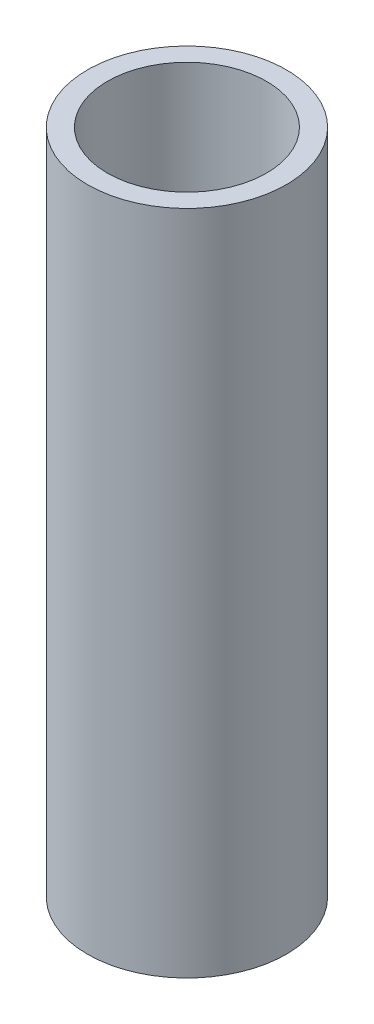
ISO-10303-21;
HEADER;
FILE_DESCRIPTION(('STEP AP214'),'2;1');
FILE_NAME('part.step','',(''),(''),'','','');
FILE_SCHEMA(('AUTOMOTIVE_DESIGN { 1 0 10303 214 1 1 1 1 }'));
ENDSEC;
DATA;
#1=APPLICATION_CONTEXT('core data for automotive mechanical design processes');
#2=APPLICATION_PROTOCOL_DEFINITION('international standard','automotive_design',2000,#1);
#3=PRODUCT_CONTEXT('',#1,'mechanical');
#4=PRODUCT('Part','Part','',(#3));
#5=PRODUCT_RELATED_PRODUCT_CATEGORY('part','',(#4));
#6=PRODUCT_DEFINITION_FORMATION('','',#4);
#7=PRODUCT_DEFINITION_CONTEXT('part definition',#1,'design');
#8=PRODUCT_DEFINITION('design','',#6,#7);
#9=PRODUCT_DEFINITION_SHAPE('','',#8);
#10=(LENGTH_UNIT() NAMED_UNIT(*) SI_UNIT(.MILLI.,.METRE.));
#11=(NAMED_UNIT(*) PLANE_ANGLE_UNIT() SI_UNIT($,.RADIAN.));
#12=(NAMED_UNIT(*) SI_UNIT($,.STERADIAN.) SOLID_ANGLE_UNIT());
#13=UNCERTAINTY_MEASURE_WITH_UNIT(LENGTH_MEASURE(1.E-05),#10,'distance_accuracy_value','');
#14=(GEOMETRIC_REPRESENTATION_CONTEXT(3) GLOBAL_UNCERTAINTY_ASSIGNED_CONTEXT((#13)) GLOBAL_UNIT_ASSIGNED_CONTEXT((#10,
#11,#12)) REPRESENTATION_CONTEXT('',''));
#15=CARTESIAN_POINT('',(0.,0.,0.));
#16=DIRECTION('',(0.,0.,1.));
#17=DIRECTION('',(1.,0.,0.));
#18=AXIS2_PLACEMENT_3D('',#15,#16,#17);
#19=CARTESIAN_POINT('',(0.,293.125,0.));
#20=DIRECTION('',(0.,1.,0.));
#21=DIRECTION('',(0.,0.,1.));
#22=AXIS2_PLACEMENT_3D('',#19,#20,#21);
#23=PLANE('',#22);
#24=CARTESIAN_POINT('',(0.,293.125,0.));
#25=DIRECTION('',(0.,1.,0.));
#26=DIRECTION('',(0.,0.,1.));
#27=AXIS2_PLACEMENT_3D('',#24,#25,#26);
#28=CIRCLE('',#27,37.5);
#29=CARTESIAN_POINT('',(0.,293.125,37.5));
#30=VERTEX_POINT('',#29);
#31=EDGE_CURVE('E11',#30,#30,#28,.T.);
#32=ORIENTED_EDGE('',*,*,#31,.T.);
#33=EDGE_LOOP('',(#32));
#34=FACE_BOUND('',#33,.T.);
#35=CARTESIAN_POINT('',(0.,293.125,0.));
#36=DIRECTION('',(0.,1.,0.));
#37=DIRECTION('',(0.,0.,1.));
#38=AXIS2_PLACEMENT_3D('',#35,#36,#37);
#39=CIRCLE('',#38,30.);
#40=CARTESIAN_POINT('',(0.,293.125,30.));
#41=VERTEX_POINT('',#40);
#42=EDGE_CURVE('E60',#41,#41,#39,.T.);
#43=ORIENTED_EDGE('',*,*,#42,.F.);
#44=EDGE_LOOP('',(#43));
#45=FACE_BOUND('',#44,.T.);
#46=ADVANCED_FACE('F46',(#34,#45),#23,.T.);
#47=CARTESIAN_POINT('',(0.,41.875,0.));
#48=DIRECTION('',(0.,1.,0.));
#49=DIRECTION('',(0.,0.,1.));
#50=AXIS2_PLACEMENT_3D('',#47,#48,#49);
#51=PLANE('',#50);
#52=CARTESIAN_POINT('',(0.,41.875,0.));
#53=DIRECTION('',(0.,1.,0.));
#54=DIRECTION('',(0.,0.,1.));
#55=AXIS2_PLACEMENT_3D('',#52,#53,#54);
#56=CIRCLE('',#55,37.5);
#57=CARTESIAN_POINT('',(0.,41.875,37.5));
#58=VERTEX_POINT('',#57);
#59=EDGE_CURVE('E49',#58,#58,#56,.T.);
#60=ORIENTED_EDGE('',*,*,#59,.F.);
#61=EDGE_LOOP('',(#60));
#62=FACE_BOUND('',#61,.T.);
#63=CARTESIAN_POINT('',(0.,41.875,0.));
#64=DIRECTION('',(0.,1.,0.));
#65=DIRECTION('',(0.,0.,1.));
#66=AXIS2_PLACEMENT_3D('',#63,#64,#65);
#67=CIRCLE('',#66,30.);
#68=CARTESIAN_POINT('',(0.,41.875,30.));
#69=VERTEX_POINT('',#68);
#70=EDGE_CURVE('E56',#69,#69,#67,.T.);
#71=ORIENTED_EDGE('',*,*,#70,.T.);
#72=EDGE_LOOP('',(#71));
#73=FACE_BOUND('',#72,.T.);
#74=ADVANCED_FACE('F66',(#62,#73),#51,.F.);
#75=CARTESIAN_POINT('',(0.,293.125,0.));
#76=DIRECTION('',(0.,-1.,0.));
#77=DIRECTION('',(0.,0.,-1.));
#78=AXIS2_PLACEMENT_3D('',#75,#76,#77);
#79=CYLINDRICAL_SURFACE('',#78,37.5);
#80=ORIENTED_EDGE('',*,*,#31,.F.);
#81=EDGE_LOOP('',(#80));
#82=FACE_BOUND('',#81,.T.);
#83=ORIENTED_EDGE('',*,*,#59,.T.);
#84=EDGE_LOOP('',(#83));
#85=FACE_BOUND('',#84,.T.);
#86=ADVANCED_FACE('F48',(#82,#85),#79,.T.);
#87=CARTESIAN_POINT('',(0.,293.125,0.));
#88=DIRECTION('',(0.,-1.,0.));
#89=DIRECTION('',(0.,0.,-1.));
#90=AXIS2_PLACEMENT_3D('',#87,#88,#89);
#91=CYLINDRICAL_SURFACE('',#90,30.);
#92=ORIENTED_EDGE('',*,*,#42,.T.);
#93=EDGE_LOOP('',(#92));
#94=FACE_BOUND('',#93,.T.);
#95=ORIENTED_EDGE('',*,*,#70,.F.);
#96=EDGE_LOOP('',(#95));
#97=FACE_BOUND('',#96,.T.);
#98=ADVANCED_FACE('F62',(#94,#97),#91,.F.);
#99=CLOSED_SHELL('',(#46,#74,#86,#98));
#100=MANIFOLD_SOLID_BREP('B2',#99);
#101=ADVANCED_BREP_SHAPE_REPRESENTATION('',(#18,#100),#14);
#102=SHAPE_DEFINITION_REPRESENTATION(#9,#101);
ENDSEC;
END-ISO-10303-21;
